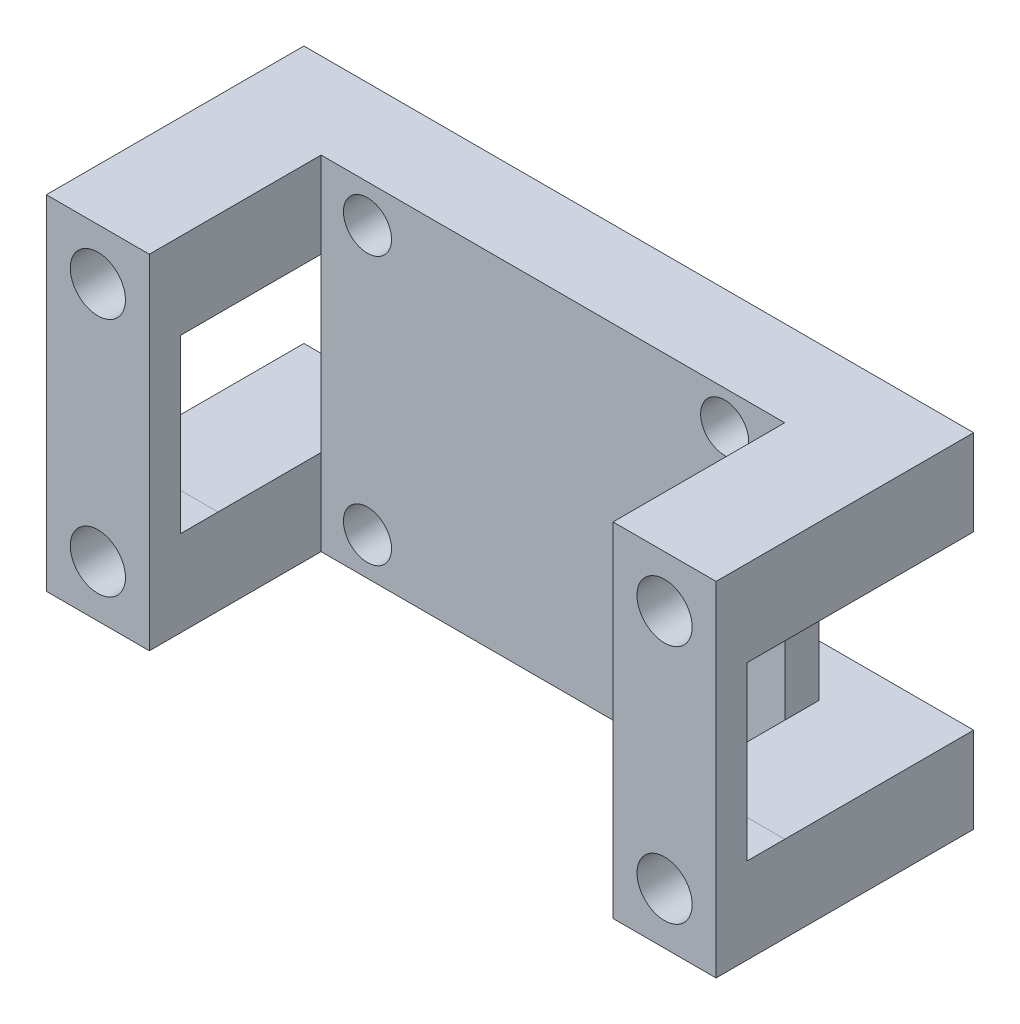
ISO-10303-21;
HEADER;
FILE_DESCRIPTION(('STEP AP214'),'2;1');
FILE_NAME('part.step','',(''),(''),'','','');
FILE_SCHEMA(('AUTOMOTIVE_DESIGN { 1 0 10303 214 1 1 1 1 }'));
ENDSEC;
DATA;
#1=APPLICATION_CONTEXT('core data for automotive mechanical design processes');
#2=APPLICATION_PROTOCOL_DEFINITION('international standard','automotive_design',2000,#1);
#3=PRODUCT_CONTEXT('',#1,'mechanical');
#4=PRODUCT('Part','Part','',(#3));
#5=PRODUCT_RELATED_PRODUCT_CATEGORY('part','',(#4));
#6=PRODUCT_DEFINITION_FORMATION('','',#4);
#7=PRODUCT_DEFINITION_CONTEXT('part definition',#1,'design');
#8=PRODUCT_DEFINITION('design','',#6,#7);
#9=PRODUCT_DEFINITION_SHAPE('','',#8);
#10=(LENGTH_UNIT() NAMED_UNIT(*) SI_UNIT(.MILLI.,.METRE.));
#11=(NAMED_UNIT(*) PLANE_ANGLE_UNIT() SI_UNIT($,.RADIAN.));
#12=(NAMED_UNIT(*) SI_UNIT($,.STERADIAN.) SOLID_ANGLE_UNIT());
#13=UNCERTAINTY_MEASURE_WITH_UNIT(LENGTH_MEASURE(1.E-05),#10,'distance_accuracy_value','');
#14=(GEOMETRIC_REPRESENTATION_CONTEXT(3) GLOBAL_UNCERTAINTY_ASSIGNED_CONTEXT((#13)) GLOBAL_UNIT_ASSIGNED_CONTEXT((#10,
#11,#12)) REPRESENTATION_CONTEXT('',''));
#15=CARTESIAN_POINT('',(0.,0.,0.));
#16=DIRECTION('',(0.,0.,1.));
#17=DIRECTION('',(1.,0.,0.));
#18=AXIS2_PLACEMENT_3D('',#15,#16,#17);
#19=CARTESIAN_POINT('',(0.,0.,2.54));
#20=DIRECTION('',(1.,0.,0.));
#21=DIRECTION('',(0.,0.,-1.));
#22=AXIS2_PLACEMENT_3D('',#19,#20,#21);
#23=PLANE('',#22);
#24=DIRECTION('',(0.,0.,-1.));
#25=VECTOR('',#24,1.);
#26=CARTESIAN_POINT('',(0.,6.35,15.24));
#27=LINE('',#26,#25);
#28=CARTESIAN_POINT('',(0.,6.35,2.54));
#29=VERTEX_POINT('',#28);
#30=CARTESIAN_POINT('',(0.,6.35,0.));
#31=VERTEX_POINT('',#30);
#32=EDGE_CURVE('E295',#29,#31,#27,.T.);
#33=ORIENTED_EDGE('',*,*,#32,.F.);
#34=DIRECTION('',(0.,-1.,0.));
#35=VECTOR('',#34,1.);
#36=CARTESIAN_POINT('',(0.,0.,2.54));
#37=LINE('',#36,#35);
#38=CARTESIAN_POINT('',(0.,19.05,2.54));
#39=VERTEX_POINT('',#38);
#40=EDGE_CURVE('E448',#39,#29,#37,.T.);
#41=ORIENTED_EDGE('',*,*,#40,.F.);
#42=DIRECTION('',(0.,0.,-1.));
#43=VECTOR('',#42,1.);
#44=CARTESIAN_POINT('',(0.,19.05,15.24));
#45=LINE('',#44,#43);
#46=CARTESIAN_POINT('',(0.,19.05,0.));
#47=VERTEX_POINT('',#46);
#48=EDGE_CURVE('E347',#39,#47,#45,.T.);
#49=ORIENTED_EDGE('',*,*,#48,.T.);
#50=DIRECTION('',(0.,-1.,0.));
#51=VECTOR('',#50,1.);
#52=CARTESIAN_POINT('',(0.,0.,0.));
#53=LINE('',#52,#51);
#54=EDGE_CURVE('E442',#47,#31,#53,.T.);
#55=ORIENTED_EDGE('',*,*,#54,.T.);
#56=EDGE_LOOP('',(#33,#41,#49,#55));
#57=FACE_BOUND('',#56,.T.);
#58=ADVANCED_FACE('F39',(#57),#23,.F.);
#59=CARTESIAN_POINT('',(34.29,0.,2.54));
#60=DIRECTION('',(-1.,0.,0.));
#61=DIRECTION('',(0.,0.,1.));
#62=AXIS2_PLACEMENT_3D('',#59,#60,#61);
#63=PLANE('',#62);
#64=DIRECTION('',(0.,0.,-1.));
#65=VECTOR('',#64,1.);
#66=CARTESIAN_POINT('',(34.29,6.34999999999999,15.24));
#67=LINE('',#66,#65);
#68=CARTESIAN_POINT('',(34.29,6.34999999999999,2.54));
#69=VERTEX_POINT('',#68);
#70=CARTESIAN_POINT('',(34.29,6.34999999999999,0.));
#71=VERTEX_POINT('',#70);
#72=EDGE_CURVE('E310',#69,#71,#67,.T.);
#73=ORIENTED_EDGE('',*,*,#72,.T.);
#74=DIRECTION('',(0.,1.,0.));
#75=VECTOR('',#74,1.);
#76=CARTESIAN_POINT('',(34.29,0.,0.));
#77=LINE('',#76,#75);
#78=CARTESIAN_POINT('',(34.29,19.05,0.));
#79=VERTEX_POINT('',#78);
#80=EDGE_CURVE('E463',#71,#79,#77,.T.);
#81=ORIENTED_EDGE('',*,*,#80,.T.);
#82=DIRECTION('',(0.,0.,-1.));
#83=VECTOR('',#82,1.);
#84=CARTESIAN_POINT('',(34.29,19.05,15.24));
#85=LINE('',#84,#83);
#86=CARTESIAN_POINT('',(34.29,19.05,2.54));
#87=VERTEX_POINT('',#86);
#88=EDGE_CURVE('E327',#87,#79,#85,.T.);
#89=ORIENTED_EDGE('',*,*,#88,.F.);
#90=DIRECTION('',(0.,1.,0.));
#91=VECTOR('',#90,1.);
#92=CARTESIAN_POINT('',(34.29,0.,2.54));
#93=LINE('',#92,#91);
#94=EDGE_CURVE('E452',#69,#87,#93,.T.);
#95=ORIENTED_EDGE('',*,*,#94,.F.);
#96=EDGE_LOOP('',(#73,#81,#89,#95));
#97=FACE_BOUND('',#96,.T.);
#98=ADVANCED_FACE('F555',(#97),#63,.F.);
#99=CARTESIAN_POINT('',(0.,0.,0.));
#100=DIRECTION('',(0.,0.,-1.));
#101=DIRECTION('',(-1.,0.,0.));
#102=AXIS2_PLACEMENT_3D('',#99,#100,#101);
#103=PLANE('',#102);
#104=ORIENTED_EDGE('',*,*,#80,.F.);
#105=DIRECTION('',(-1.,0.,0.));
#106=VECTOR('',#105,1.);
#107=CARTESIAN_POINT('',(0.,6.35,0.));
#108=LINE('',#107,#106);
#109=EDGE_CURVE('E47',#71,#31,#108,.T.);
#110=ORIENTED_EDGE('',*,*,#109,.T.);
#111=ORIENTED_EDGE('',*,*,#54,.F.);
#112=DIRECTION('',(-1.,0.,0.));
#113=VECTOR('',#112,1.);
#114=CARTESIAN_POINT('',(-7.62,19.05,0.));
#115=LINE('',#114,#113);
#116=EDGE_CURVE('E426',#79,#47,#115,.T.);
#117=ORIENTED_EDGE('',*,*,#116,.F.);
#118=EDGE_LOOP('',(#104,#110,#111,#117));
#119=FACE_BOUND('',#118,.T.);
#120=ADVANCED_FACE('F472',(#119),#103,.T.);
#121=CARTESIAN_POINT('',(0.,0.,2.54));
#122=DIRECTION('',(0.,1.,0.));
#123=DIRECTION('',(0.,0.,1.));
#124=AXIS2_PLACEMENT_3D('',#121,#122,#123);
#125=PLANE('',#124);
#126=DIRECTION('',(0.,0.,1.));
#127=VECTOR('',#126,1.);
#128=CARTESIAN_POINT('',(41.91,0.,-3.81));
#129=LINE('',#128,#127);
#130=CARTESIAN_POINT('',(41.91,0.,-3.81));
#131=VERTEX_POINT('',#130);
#132=CARTESIAN_POINT('',(41.91,0.,15.24));
#133=VERTEX_POINT('',#132);
#134=EDGE_CURVE('E402',#131,#133,#129,.T.);
#135=ORIENTED_EDGE('',*,*,#134,.T.);
#136=DIRECTION('',(1.,0.,0.));
#137=VECTOR('',#136,1.);
#138=CARTESIAN_POINT('',(41.91,0.,15.24));
#139=LINE('',#138,#137);
#140=CARTESIAN_POINT('',(34.29,0.,15.24));
#141=VERTEX_POINT('',#140);
#142=EDGE_CURVE('E303',#141,#133,#139,.T.);
#143=ORIENTED_EDGE('',*,*,#142,.F.);
#144=DIRECTION('',(0.,0.,-1.));
#145=VECTOR('',#144,1.);
#146=CARTESIAN_POINT('',(34.29,0.,15.24));
#147=LINE('',#146,#145);
#148=CARTESIAN_POINT('',(34.29,0.,2.54));
#149=VERTEX_POINT('',#148);
#150=EDGE_CURVE('E307',#141,#149,#147,.T.);
#151=ORIENTED_EDGE('',*,*,#150,.T.);
#152=DIRECTION('',(1.,0.,0.));
#153=VECTOR('',#152,1.);
#154=CARTESIAN_POINT('',(0.,0.,2.54));
#155=LINE('',#154,#153);
#156=CARTESIAN_POINT('',(0.,0.,2.54));
#157=VERTEX_POINT('',#156);
#158=EDGE_CURVE('E447',#157,#149,#155,.T.);
#159=ORIENTED_EDGE('',*,*,#158,.F.);
#160=DIRECTION('',(0.,0.,-1.));
#161=VECTOR('',#160,1.);
#162=CARTESIAN_POINT('',(0.,0.,15.24));
#163=LINE('',#162,#161);
#164=CARTESIAN_POINT('',(0.,0.,15.24));
#165=VERTEX_POINT('',#164);
#166=EDGE_CURVE('E292',#165,#157,#163,.T.);
#167=ORIENTED_EDGE('',*,*,#166,.F.);
#168=DIRECTION('',(1.,0.,0.));
#169=VECTOR('',#168,1.);
#170=CARTESIAN_POINT('',(0.,0.,15.24));
#171=LINE('',#170,#169);
#172=CARTESIAN_POINT('',(-7.62,0.,15.24));
#173=VERTEX_POINT('',#172);
#174=EDGE_CURVE('E288',#173,#165,#171,.T.);
#175=ORIENTED_EDGE('',*,*,#174,.F.);
#176=DIRECTION('',(0.,0.,1.));
#177=VECTOR('',#176,1.);
#178=CARTESIAN_POINT('',(-7.62,0.,-3.81));
#179=LINE('',#178,#177);
#180=CARTESIAN_POINT('',(-7.62,0.,-3.81));
#181=VERTEX_POINT('',#180);
#182=EDGE_CURVE('E399',#181,#173,#179,.T.);
#183=ORIENTED_EDGE('',*,*,#182,.F.);
#184=DIRECTION('',(-1.,0.,0.));
#185=VECTOR('',#184,1.);
#186=CARTESIAN_POINT('',(-7.62,0.,-3.81));
#187=LINE('',#186,#185);
#188=EDGE_CURVE('E396',#131,#181,#187,.T.);
#189=ORIENTED_EDGE('',*,*,#188,.F.);
#190=EDGE_LOOP('',(#135,#143,#151,#159,#167,#175,#183,#189));
#191=FACE_BOUND('',#190,.T.);
#192=ADVANCED_FACE('F515',(#191),#125,.F.);
#193=CARTESIAN_POINT('',(0.,25.4,2.54));
#194=DIRECTION('',(0.,-1.,0.));
#195=DIRECTION('',(0.,0.,-1.));
#196=AXIS2_PLACEMENT_3D('',#193,#194,#195);
#197=PLANE('',#196);
#198=DIRECTION('',(-1.,0.,0.));
#199=VECTOR('',#198,1.);
#200=CARTESIAN_POINT('',(0.,25.4,2.54));
#201=LINE('',#200,#199);
#202=CARTESIAN_POINT('',(34.29,25.4,2.54));
#203=VERTEX_POINT('',#202);
#204=CARTESIAN_POINT('',(0.,25.4,2.54));
#205=VERTEX_POINT('',#204);
#206=EDGE_CURVE('E430',#203,#205,#201,.T.);
#207=ORIENTED_EDGE('',*,*,#206,.F.);
#208=DIRECTION('',(0.,0.,-1.));
#209=VECTOR('',#208,1.);
#210=CARTESIAN_POINT('',(34.29,25.4,15.24));
#211=LINE('',#210,#209);
#212=CARTESIAN_POINT('',(34.29,25.4,15.24));
#213=VERTEX_POINT('',#212);
#214=EDGE_CURVE('E324',#213,#203,#211,.T.);
#215=ORIENTED_EDGE('',*,*,#214,.F.);
#216=DIRECTION('',(-1.,0.,0.));
#217=VECTOR('',#216,1.);
#218=CARTESIAN_POINT('',(34.29,25.4,15.24));
#219=LINE('',#218,#217);
#220=CARTESIAN_POINT('',(41.91,25.4,15.24));
#221=VERTEX_POINT('',#220);
#222=EDGE_CURVE('E321',#221,#213,#219,.T.);
#223=ORIENTED_EDGE('',*,*,#222,.F.);
#224=DIRECTION('',(0.,0.,1.));
#225=VECTOR('',#224,1.);
#226=CARTESIAN_POINT('',(41.91,25.4,-3.81));
#227=LINE('',#226,#225);
#228=CARTESIAN_POINT('',(41.91,25.4,-3.81));
#229=VERTEX_POINT('',#228);
#230=EDGE_CURVE('E436',#229,#221,#227,.T.);
#231=ORIENTED_EDGE('',*,*,#230,.F.);
#232=DIRECTION('',(1.,0.,0.));
#233=VECTOR('',#232,1.);
#234=CARTESIAN_POINT('',(-7.62,25.4,-3.81));
#235=LINE('',#234,#233);
#236=CARTESIAN_POINT('',(-7.62,25.4,-3.81));
#237=VERTEX_POINT('',#236);
#238=EDGE_CURVE('E416',#237,#229,#235,.T.);
#239=ORIENTED_EDGE('',*,*,#238,.F.);
#240=DIRECTION('',(0.,0.,1.));
#241=VECTOR('',#240,1.);
#242=CARTESIAN_POINT('',(-7.62,25.4,-3.81));
#243=LINE('',#242,#241);
#244=CARTESIAN_POINT('',(-7.62,25.4,15.24));
#245=VERTEX_POINT('',#244);
#246=EDGE_CURVE('E439',#237,#245,#243,.T.);
#247=ORIENTED_EDGE('',*,*,#246,.T.);
#248=DIRECTION('',(-1.,0.,0.));
#249=VECTOR('',#248,1.);
#250=CARTESIAN_POINT('',(0.,25.4,15.24));
#251=LINE('',#250,#249);
#252=CARTESIAN_POINT('',(0.,25.4,15.24));
#253=VERTEX_POINT('',#252);
#254=EDGE_CURVE('E339',#253,#245,#251,.T.);
#255=ORIENTED_EDGE('',*,*,#254,.F.);
#256=DIRECTION('',(0.,0.,-1.));
#257=VECTOR('',#256,1.);
#258=CARTESIAN_POINT('',(0.,25.4,15.24));
#259=LINE('',#258,#257);
#260=EDGE_CURVE('E351',#253,#205,#259,.T.);
#261=ORIENTED_EDGE('',*,*,#260,.T.);
#262=EDGE_LOOP('',(#207,#215,#223,#231,#239,#247,#255,#261));
#263=FACE_BOUND('',#262,.T.);
#264=ADVANCED_FACE('F525',(#263),#197,.F.);
#265=CARTESIAN_POINT('',(0.,0.,2.54));
#266=DIRECTION('',(0.,0.,-1.));
#267=DIRECTION('',(-1.,0.,0.));
#268=AXIS2_PLACEMENT_3D('',#265,#266,#267);
#269=PLANE('',#268);
#270=CARTESIAN_POINT('',(29.845,22.86,2.54));
#271=DIRECTION('',(0.,0.,-1.));
#272=DIRECTION('',(-1.,0.,0.));
#273=AXIS2_PLACEMENT_3D('',#270,#271,#272);
#274=CIRCLE('',#273,1.77799999999999);
#275=CARTESIAN_POINT('',(28.067,22.86,2.54));
#276=VERTEX_POINT('',#275);
#277=EDGE_CURVE('E382',#276,#276,#274,.T.);
#278=ORIENTED_EDGE('',*,*,#277,.T.);
#279=EDGE_LOOP('',(#278));
#280=FACE_BOUND('',#279,.T.);
#281=CARTESIAN_POINT('',(3.429,2.794,2.54));
#282=DIRECTION('',(0.,0.,-1.));
#283=DIRECTION('',(-1.,0.,0.));
#284=AXIS2_PLACEMENT_3D('',#281,#282,#283);
#285=CIRCLE('',#284,1.778);
#286=CARTESIAN_POINT('',(1.651,2.794,2.54));
#287=VERTEX_POINT('',#286);
#288=EDGE_CURVE('E374',#287,#287,#285,.T.);
#289=ORIENTED_EDGE('',*,*,#288,.T.);
#290=EDGE_LOOP('',(#289));
#291=FACE_BOUND('',#290,.T.);
#292=CARTESIAN_POINT('',(29.845,2.286,2.54));
#293=DIRECTION('',(0.,0.,-1.));
#294=DIRECTION('',(-1.,0.,0.));
#295=AXIS2_PLACEMENT_3D('',#292,#293,#294);
#296=CIRCLE('',#295,1.77799999999999);
#297=CARTESIAN_POINT('',(28.067,2.286,2.54));
#298=VERTEX_POINT('',#297);
#299=EDGE_CURVE('E370',#298,#298,#296,.T.);
#300=ORIENTED_EDGE('',*,*,#299,.T.);
#301=EDGE_LOOP('',(#300));
#302=FACE_BOUND('',#301,.T.);
#303=CARTESIAN_POINT('',(3.429,22.606,2.54));
#304=DIRECTION('',(0.,0.,-1.));
#305=DIRECTION('',(-1.,0.,0.));
#306=AXIS2_PLACEMENT_3D('',#303,#304,#305);
#307=CIRCLE('',#306,1.778);
#308=CARTESIAN_POINT('',(1.651,22.606,2.54));
#309=VERTEX_POINT('',#308);
#310=EDGE_CURVE('E378',#309,#309,#307,.T.);
#311=ORIENTED_EDGE('',*,*,#310,.T.);
#312=EDGE_LOOP('',(#311));
#313=FACE_BOUND('',#312,.T.);
#314=EDGE_CURVE('E443',#205,#39,#37,.T.);
#315=ORIENTED_EDGE('',*,*,#314,.T.);
#316=ORIENTED_EDGE('',*,*,#40,.T.);
#317=DIRECTION('',(0.,1.,0.));
#318=VECTOR('',#317,1.);
#319=CARTESIAN_POINT('',(0.,0.,2.54));
#320=LINE('',#319,#318);
#321=EDGE_CURVE('E299',#157,#29,#320,.T.);
#322=ORIENTED_EDGE('',*,*,#321,.F.);
#323=ORIENTED_EDGE('',*,*,#158,.T.);
#324=EDGE_CURVE('E453',#149,#69,#93,.T.);
#325=ORIENTED_EDGE('',*,*,#324,.T.);
#326=ORIENTED_EDGE('',*,*,#94,.T.);
#327=DIRECTION('',(0.,-1.,0.));
#328=VECTOR('',#327,1.);
#329=CARTESIAN_POINT('',(34.29,0.,2.54));
#330=LINE('',#329,#328);
#331=EDGE_CURVE('E331',#203,#87,#330,.T.);
#332=ORIENTED_EDGE('',*,*,#331,.F.);
#333=ORIENTED_EDGE('',*,*,#206,.T.);
#334=EDGE_LOOP('',(#315,#316,#322,#323,#325,#326,#332,#333));
#335=FACE_BOUND('',#334,.T.);
#336=ADVANCED_FACE('F541',(#280,#291,#302,#313,#335),#269,.F.);
#337=CARTESIAN_POINT('',(-7.62,25.4,-3.81));
#338=DIRECTION('',(1.,0.,0.));
#339=DIRECTION('',(0.,1.,0.));
#340=AXIS2_PLACEMENT_3D('',#337,#338,#339);
#341=PLANE('',#340);
#342=DIRECTION('',(0.,0.,1.));
#343=VECTOR('',#342,1.);
#344=CARTESIAN_POINT('',(-7.62,19.05,-3.81));
#345=LINE('',#344,#343);
#346=CARTESIAN_POINT('',(-7.62,19.05,-3.81));
#347=VERTEX_POINT('',#346);
#348=CARTESIAN_POINT('',(-7.62,19.05,12.954));
#349=VERTEX_POINT('',#348);
#350=EDGE_CURVE('E425',#347,#349,#345,.T.);
#351=ORIENTED_EDGE('',*,*,#350,.T.);
#352=DIRECTION('',(0.,1.,0.));
#353=VECTOR('',#352,1.);
#354=CARTESIAN_POINT('',(-7.62,19.05,12.954));
#355=LINE('',#354,#353);
#356=CARTESIAN_POINT('',(-7.62,6.35030873739666,12.954));
#357=VERTEX_POINT('',#356);
#358=EDGE_CURVE('E214',#357,#349,#355,.T.);
#359=ORIENTED_EDGE('',*,*,#358,.F.);
#360=DIRECTION('',(0.,0.,1.));
#361=VECTOR('',#360,1.);
#362=CARTESIAN_POINT('',(-7.62,6.35030873739666,10.16));
#363=LINE('',#362,#361);
#364=CARTESIAN_POINT('',(-7.62,6.35030873739666,10.16));
#365=VERTEX_POINT('',#364);
#366=EDGE_CURVE('E218',#365,#357,#363,.T.);
#367=ORIENTED_EDGE('',*,*,#366,.F.);
#368=DIRECTION('',(0.,-1.,0.));
#369=VECTOR('',#368,1.);
#370=CARTESIAN_POINT('',(-7.62,25.4,10.16));
#371=LINE('',#370,#369);
#372=CARTESIAN_POINT('',(-7.62,6.35,10.16));
#373=VERTEX_POINT('',#372);
#374=EDGE_CURVE('E278',#365,#373,#371,.T.);
#375=ORIENTED_EDGE('',*,*,#374,.T.);
#376=DIRECTION('',(0.,0.,1.));
#377=VECTOR('',#376,1.);
#378=CARTESIAN_POINT('',(-7.62,6.35,-3.81));
#379=LINE('',#378,#377);
#380=CARTESIAN_POINT('',(-7.62,6.35,-3.81));
#381=VERTEX_POINT('',#380);
#382=EDGE_CURVE('E408',#381,#373,#379,.T.);
#383=ORIENTED_EDGE('',*,*,#382,.F.);
#384=DIRECTION('',(0.,1.,0.));
#385=VECTOR('',#384,1.);
#386=CARTESIAN_POINT('',(-7.62,0.,-3.81));
#387=LINE('',#386,#385);
#388=EDGE_CURVE('E386',#181,#381,#387,.T.);
#389=ORIENTED_EDGE('',*,*,#388,.F.);
#390=ORIENTED_EDGE('',*,*,#182,.T.);
#391=DIRECTION('',(0.,-1.,0.));
#392=VECTOR('',#391,1.);
#393=CARTESIAN_POINT('',(-7.62,25.4,15.24));
#394=LINE('',#393,#392);
#395=EDGE_CURVE('E343',#245,#173,#394,.T.);
#396=ORIENTED_EDGE('',*,*,#395,.F.);
#397=ORIENTED_EDGE('',*,*,#246,.F.);
#398=DIRECTION('',(0.,1.,0.));
#399=VECTOR('',#398,1.);
#400=CARTESIAN_POINT('',(-7.62,25.4,-3.81));
#401=LINE('',#400,#399);
#402=EDGE_CURVE('E412',#347,#237,#401,.T.);
#403=ORIENTED_EDGE('',*,*,#402,.F.);
#404=EDGE_LOOP('',(#351,#359,#367,#375,#383,#389,#390,#396,#397,#403));
#405=FACE_BOUND('',#404,.T.);
#406=ADVANCED_FACE('F497',(#405),#341,.F.);
#407=CARTESIAN_POINT('',(41.91,25.4,-3.81));
#408=DIRECTION('',(-1.,0.,0.));
#409=DIRECTION('',(0.,0.,1.));
#410=AXIS2_PLACEMENT_3D('',#407,#408,#409);
#411=PLANE('',#410);
#412=DIRECTION('',(0.,1.,0.));
#413=VECTOR('',#412,1.);
#414=CARTESIAN_POINT('',(41.91,19.05,12.954));
#415=LINE('',#414,#413);
#416=CARTESIAN_POINT('',(41.91,6.35030873739665,12.954));
#417=VERTEX_POINT('',#416);
#418=CARTESIAN_POINT('',(41.91,19.05,12.954));
#419=VERTEX_POINT('',#418);
#420=EDGE_CURVE('E200',#417,#419,#415,.T.);
#421=ORIENTED_EDGE('',*,*,#420,.T.);
#422=DIRECTION('',(0.,0.,1.));
#423=VECTOR('',#422,1.);
#424=CARTESIAN_POINT('',(41.91,19.05,-3.81));
#425=LINE('',#424,#423);
#426=CARTESIAN_POINT('',(41.91,19.05,-3.81));
#427=VERTEX_POINT('',#426);
#428=EDGE_CURVE('E433',#427,#419,#425,.T.);
#429=ORIENTED_EDGE('',*,*,#428,.F.);
#430=DIRECTION('',(0.,-1.,0.));
#431=VECTOR('',#430,1.);
#432=CARTESIAN_POINT('',(41.91,25.4,-3.81));
#433=LINE('',#432,#431);
#434=EDGE_CURVE('E419',#229,#427,#433,.T.);
#435=ORIENTED_EDGE('',*,*,#434,.F.);
#436=ORIENTED_EDGE('',*,*,#230,.T.);
#437=DIRECTION('',(0.,1.,0.));
#438=VECTOR('',#437,1.);
#439=CARTESIAN_POINT('',(41.91,25.4,15.24));
#440=LINE('',#439,#438);
#441=EDGE_CURVE('E317',#133,#221,#440,.T.);
#442=ORIENTED_EDGE('',*,*,#441,.F.);
#443=ORIENTED_EDGE('',*,*,#134,.F.);
#444=DIRECTION('',(0.,-1.,0.));
#445=VECTOR('',#444,1.);
#446=CARTESIAN_POINT('',(41.91,0.,-3.81));
#447=LINE('',#446,#445);
#448=CARTESIAN_POINT('',(41.91,6.34999999999999,-3.81));
#449=VERTEX_POINT('',#448);
#450=EDGE_CURVE('E393',#449,#131,#447,.T.);
#451=ORIENTED_EDGE('',*,*,#450,.F.);
#452=DIRECTION('',(0.,0.,1.));
#453=VECTOR('',#452,1.);
#454=CARTESIAN_POINT('',(41.91,6.34999999999999,-3.81));
#455=LINE('',#454,#453);
#456=CARTESIAN_POINT('',(41.91,6.34999999999999,10.16));
#457=VERTEX_POINT('',#456);
#458=EDGE_CURVE('E405',#449,#457,#455,.T.);
#459=ORIENTED_EDGE('',*,*,#458,.T.);
#460=DIRECTION('',(0.,-1.,0.));
#461=VECTOR('',#460,1.);
#462=CARTESIAN_POINT('',(41.91,25.4,10.16));
#463=LINE('',#462,#461);
#464=CARTESIAN_POINT('',(41.91,6.35030873739665,10.16));
#465=VERTEX_POINT('',#464);
#466=EDGE_CURVE('E212',#465,#457,#463,.T.);
#467=ORIENTED_EDGE('',*,*,#466,.F.);
#468=DIRECTION('',(0.,0.,1.));
#469=VECTOR('',#468,1.);
#470=CARTESIAN_POINT('',(41.91,6.35030873739665,10.16));
#471=LINE('',#470,#469);
#472=EDGE_CURVE('E62',#465,#417,#471,.T.);
#473=ORIENTED_EDGE('',*,*,#472,.T.);
#474=EDGE_LOOP('',(#421,#429,#435,#436,#442,#443,#451,#459,#467,#473));
#475=FACE_BOUND('',#474,.T.);
#476=ADVANCED_FACE('F210',(#475),#411,.F.);
#477=CARTESIAN_POINT('',(-7.62,19.05,-3.81));
#478=DIRECTION('',(0.,1.,0.));
#479=DIRECTION('',(-1.,0.,0.));
#480=AXIS2_PLACEMENT_3D('',#477,#478,#479);
#481=PLANE('',#480);
#482=ORIENTED_EDGE('',*,*,#428,.T.);
#483=DIRECTION('',(-1.,0.,0.));
#484=VECTOR('',#483,1.);
#485=CARTESIAN_POINT('',(41.91,19.05,12.954));
#486=LINE('',#485,#484);
#487=CARTESIAN_POINT('',(34.29,19.05,12.954));
#488=VERTEX_POINT('',#487);
#489=EDGE_CURVE('E203',#419,#488,#486,.T.);
#490=ORIENTED_EDGE('',*,*,#489,.T.);
#491=EDGE_CURVE('E328',#488,#87,#85,.T.);
#492=ORIENTED_EDGE('',*,*,#491,.T.);
#493=ORIENTED_EDGE('',*,*,#88,.T.);
#494=ORIENTED_EDGE('',*,*,#116,.T.);
#495=ORIENTED_EDGE('',*,*,#48,.F.);
#496=CARTESIAN_POINT('',(0.,19.05,12.954));
#497=VERTEX_POINT('',#496);
#498=EDGE_CURVE('E348',#497,#39,#45,.T.);
#499=ORIENTED_EDGE('',*,*,#498,.F.);
#500=EDGE_CURVE('E195',#497,#349,#486,.T.);
#501=ORIENTED_EDGE('',*,*,#500,.T.);
#502=ORIENTED_EDGE('',*,*,#350,.F.);
#503=DIRECTION('',(-1.,0.,0.));
#504=VECTOR('',#503,1.);
#505=CARTESIAN_POINT('',(-7.62,19.05,-3.81));
#506=LINE('',#505,#504);
#507=EDGE_CURVE('E422',#427,#347,#506,.T.);
#508=ORIENTED_EDGE('',*,*,#507,.F.);
#509=EDGE_LOOP('',(#482,#490,#492,#493,#494,#495,#499,#501,#502,#508));
#510=FACE_BOUND('',#509,.T.);
#511=ADVANCED_FACE('F533',(#510),#481,.F.);
#512=CARTESIAN_POINT('',(0.,0.,-3.81));
#513=DIRECTION('',(0.,0.,1.));
#514=DIRECTION('',(1.,0.,0.));
#515=AXIS2_PLACEMENT_3D('',#512,#513,#514);
#516=PLANE('',#515);
#517=CARTESIAN_POINT('',(38.1,21.59,-3.81));
#518=DIRECTION('',(0.,0.,1.));
#519=DIRECTION('',(1.,0.,0.));
#520=AXIS2_PLACEMENT_3D('',#517,#518,#519);
#521=CIRCLE('',#520,2.039999984);
#522=CARTESIAN_POINT('',(40.139999984,21.59,-3.81));
#523=VERTEX_POINT('',#522);
#524=EDGE_CURVE('E246',#523,#523,#521,.T.);
#525=ORIENTED_EDGE('',*,*,#524,.T.);
#526=EDGE_LOOP('',(#525));
#527=FACE_BOUND('',#526,.T.);
#528=CARTESIAN_POINT('',(-3.81,21.59,-3.81));
#529=DIRECTION('',(0.,0.,1.));
#530=DIRECTION('',(1.,0.,0.));
#531=AXIS2_PLACEMENT_3D('',#528,#529,#530);
#532=CIRCLE('',#531,2.039999984);
#533=CARTESIAN_POINT('',(-1.770000016,21.59,-3.81));
#534=VERTEX_POINT('',#533);
#535=EDGE_CURVE('E238',#534,#534,#532,.T.);
#536=ORIENTED_EDGE('',*,*,#535,.T.);
#537=EDGE_LOOP('',(#536));
#538=FACE_BOUND('',#537,.T.);
#539=CARTESIAN_POINT('',(29.845,22.86,-3.81));
#540=DIRECTION('',(0.,0.,1.));
#541=DIRECTION('',(1.,0.,0.));
#542=AXIS2_PLACEMENT_3D('',#539,#540,#541);
#543=CIRCLE('',#542,1.77799999999999);
#544=CARTESIAN_POINT('',(31.623,22.86,-3.81));
#545=VERTEX_POINT('',#544);
#546=EDGE_CURVE('E359',#545,#545,#543,.T.);
#547=ORIENTED_EDGE('',*,*,#546,.T.);
#548=EDGE_LOOP('',(#547));
#549=FACE_BOUND('',#548,.T.);
#550=CARTESIAN_POINT('',(3.429,22.606,-3.81));
#551=DIRECTION('',(0.,0.,1.));
#552=DIRECTION('',(1.,0.,0.));
#553=AXIS2_PLACEMENT_3D('',#550,#551,#552);
#554=CIRCLE('',#553,1.778);
#555=CARTESIAN_POINT('',(5.207,22.606,-3.81));
#556=VERTEX_POINT('',#555);
#557=EDGE_CURVE('E363',#556,#556,#554,.T.);
#558=ORIENTED_EDGE('',*,*,#557,.T.);
#559=EDGE_LOOP('',(#558));
#560=FACE_BOUND('',#559,.T.);
#561=ORIENTED_EDGE('',*,*,#402,.T.);
#562=ORIENTED_EDGE('',*,*,#238,.T.);
#563=ORIENTED_EDGE('',*,*,#434,.T.);
#564=ORIENTED_EDGE('',*,*,#507,.T.);
#565=EDGE_LOOP('',(#561,#562,#563,#564));
#566=FACE_BOUND('',#565,.T.);
#567=ADVANCED_FACE('F530',(#527,#538,#549,#560,#566),#516,.F.);
#568=CARTESIAN_POINT('',(-7.62,6.35,-3.81));
#569=DIRECTION('',(0.,-1.,0.));
#570=DIRECTION('',(1.,0.,0.));
#571=AXIS2_PLACEMENT_3D('',#568,#569,#570);
#572=PLANE('',#571);
#573=CARTESIAN_POINT('',(34.29,6.34999999999999,10.16));
#574=VERTEX_POINT('',#573);
#575=EDGE_CURVE('E311',#574,#69,#67,.T.);
#576=ORIENTED_EDGE('',*,*,#575,.F.);
#577=DIRECTION('',(1.,0.,0.));
#578=VECTOR('',#577,1.);
#579=CARTESIAN_POINT('',(-7.62,6.35,10.16));
#580=LINE('',#579,#578);
#581=EDGE_CURVE('E272',#574,#457,#580,.T.);
#582=ORIENTED_EDGE('',*,*,#581,.T.);
#583=ORIENTED_EDGE('',*,*,#458,.F.);
#584=DIRECTION('',(1.,0.,0.));
#585=VECTOR('',#584,1.);
#586=CARTESIAN_POINT('',(-7.62,6.35,-3.81));
#587=LINE('',#586,#585);
#588=EDGE_CURVE('E390',#381,#449,#587,.T.);
#589=ORIENTED_EDGE('',*,*,#588,.F.);
#590=ORIENTED_EDGE('',*,*,#382,.T.);
#591=DIRECTION('',(1.,0.,0.));
#592=VECTOR('',#591,1.);
#593=CARTESIAN_POINT('',(-7.62,6.35,10.16));
#594=LINE('',#593,#592);
#595=CARTESIAN_POINT('',(0.,6.35,10.16));
#596=VERTEX_POINT('',#595);
#597=EDGE_CURVE('E282',#373,#596,#594,.T.);
#598=ORIENTED_EDGE('',*,*,#597,.T.);
#599=EDGE_CURVE('E296',#596,#29,#27,.T.);
#600=ORIENTED_EDGE('',*,*,#599,.T.);
#601=ORIENTED_EDGE('',*,*,#32,.T.);
#602=ORIENTED_EDGE('',*,*,#109,.F.);
#603=ORIENTED_EDGE('',*,*,#72,.F.);
#604=EDGE_LOOP('',(#576,#582,#583,#589,#590,#598,#600,#601,#602,#603));
#605=FACE_BOUND('',#604,.T.);
#606=ADVANCED_FACE('F503',(#605),#572,.F.);
#607=CARTESIAN_POINT('',(0.,0.,-3.81));
#608=DIRECTION('',(0.,0.,-1.));
#609=DIRECTION('',(-1.,0.,0.));
#610=AXIS2_PLACEMENT_3D('',#607,#608,#609);
#611=PLANE('',#610);
#612=CARTESIAN_POINT('',(-3.81,3.81,-3.81));
#613=DIRECTION('',(0.,0.,1.));
#614=DIRECTION('',(1.,0.,0.));
#615=AXIS2_PLACEMENT_3D('',#612,#613,#614);
#616=CIRCLE('',#615,2.039999984);
#617=CARTESIAN_POINT('',(-1.770000016,3.81,-3.81));
#618=VERTEX_POINT('',#617);
#619=EDGE_CURVE('E255',#618,#618,#616,.T.);
#620=ORIENTED_EDGE('',*,*,#619,.T.);
#621=EDGE_LOOP('',(#620));
#622=FACE_BOUND('',#621,.T.);
#623=CARTESIAN_POINT('',(38.1,3.81,-3.81));
#624=DIRECTION('',(0.,0.,1.));
#625=DIRECTION('',(1.,0.,0.));
#626=AXIS2_PLACEMENT_3D('',#623,#624,#625);
#627=CIRCLE('',#626,2.04);
#628=CARTESIAN_POINT('',(40.14,3.81,-3.81));
#629=VERTEX_POINT('',#628);
#630=EDGE_CURVE('E262',#629,#629,#627,.T.);
#631=ORIENTED_EDGE('',*,*,#630,.T.);
#632=EDGE_LOOP('',(#631));
#633=FACE_BOUND('',#632,.T.);
#634=CARTESIAN_POINT('',(3.429,2.794,-3.81));
#635=DIRECTION('',(0.,0.,1.));
#636=DIRECTION('',(1.,0.,0.));
#637=AXIS2_PLACEMENT_3D('',#634,#635,#636);
#638=CIRCLE('',#637,1.778);
#639=CARTESIAN_POINT('',(5.207,2.794,-3.81));
#640=VERTEX_POINT('',#639);
#641=EDGE_CURVE('E358',#640,#640,#638,.T.);
#642=ORIENTED_EDGE('',*,*,#641,.T.);
#643=EDGE_LOOP('',(#642));
#644=FACE_BOUND('',#643,.T.);
#645=CARTESIAN_POINT('',(29.845,2.286,-3.81));
#646=DIRECTION('',(0.,0.,1.));
#647=DIRECTION('',(1.,0.,0.));
#648=AXIS2_PLACEMENT_3D('',#645,#646,#647);
#649=CIRCLE('',#648,1.77799999999999);
#650=CARTESIAN_POINT('',(31.623,2.286,-3.81));
#651=VERTEX_POINT('',#650);
#652=EDGE_CURVE('E354',#651,#651,#649,.T.);
#653=ORIENTED_EDGE('',*,*,#652,.T.);
#654=EDGE_LOOP('',(#653));
#655=FACE_BOUND('',#654,.T.);
#656=ORIENTED_EDGE('',*,*,#388,.T.);
#657=ORIENTED_EDGE('',*,*,#588,.T.);
#658=ORIENTED_EDGE('',*,*,#450,.T.);
#659=ORIENTED_EDGE('',*,*,#188,.T.);
#660=EDGE_LOOP('',(#656,#657,#658,#659));
#661=FACE_BOUND('',#660,.T.);
#662=ADVANCED_FACE('F509',(#622,#633,#644,#655,#661),#611,.T.);
#663=CARTESIAN_POINT('',(29.845,2.286,-3.81));
#664=DIRECTION('',(0.,0.,1.));
#665=DIRECTION('',(1.,0.,0.));
#666=AXIS2_PLACEMENT_3D('',#663,#664,#665);
#667=CYLINDRICAL_SURFACE('',#666,1.77799999999999);
#668=ORIENTED_EDGE('',*,*,#652,.F.);
#669=EDGE_LOOP('',(#668));
#670=FACE_BOUND('',#669,.T.);
#671=ORIENTED_EDGE('',*,*,#299,.F.);
#672=EDGE_LOOP('',(#671));
#673=FACE_BOUND('',#672,.T.);
#674=ADVANCED_FACE('F608',(#670,#673),#667,.F.);
#675=CARTESIAN_POINT('',(3.429,2.794,-3.81));
#676=DIRECTION('',(0.,0.,1.));
#677=DIRECTION('',(1.,0.,0.));
#678=AXIS2_PLACEMENT_3D('',#675,#676,#677);
#679=CYLINDRICAL_SURFACE('',#678,1.778);
#680=ORIENTED_EDGE('',*,*,#641,.F.);
#681=EDGE_LOOP('',(#680));
#682=FACE_BOUND('',#681,.T.);
#683=ORIENTED_EDGE('',*,*,#288,.F.);
#684=EDGE_LOOP('',(#683));
#685=FACE_BOUND('',#684,.T.);
#686=ADVANCED_FACE('F614',(#682,#685),#679,.F.);
#687=CARTESIAN_POINT('',(3.429,22.606,-3.81));
#688=DIRECTION('',(0.,0.,1.));
#689=DIRECTION('',(1.,0.,0.));
#690=AXIS2_PLACEMENT_3D('',#687,#688,#689);
#691=CYLINDRICAL_SURFACE('',#690,1.778);
#692=ORIENTED_EDGE('',*,*,#557,.F.);
#693=EDGE_LOOP('',(#692));
#694=FACE_BOUND('',#693,.T.);
#695=ORIENTED_EDGE('',*,*,#310,.F.);
#696=EDGE_LOOP('',(#695));
#697=FACE_BOUND('',#696,.T.);
#698=ADVANCED_FACE('F610',(#694,#697),#691,.F.);
#699=CARTESIAN_POINT('',(29.845,22.86,-3.81));
#700=DIRECTION('',(0.,0.,1.));
#701=DIRECTION('',(1.,0.,0.));
#702=AXIS2_PLACEMENT_3D('',#699,#700,#701);
#703=CYLINDRICAL_SURFACE('',#702,1.77799999999999);
#704=ORIENTED_EDGE('',*,*,#546,.F.);
#705=EDGE_LOOP('',(#704));
#706=FACE_BOUND('',#705,.T.);
#707=ORIENTED_EDGE('',*,*,#277,.F.);
#708=EDGE_LOOP('',(#707));
#709=FACE_BOUND('',#708,.T.);
#710=ADVANCED_FACE('F613',(#706,#709),#703,.F.);
#711=CARTESIAN_POINT('',(0.,25.4,15.24));
#712=DIRECTION('',(-1.,0.,0.));
#713=DIRECTION('',(0.,0.,1.));
#714=AXIS2_PLACEMENT_3D('',#711,#712,#713);
#715=PLANE('',#714);
#716=DIRECTION('',(0.,1.,0.));
#717=VECTOR('',#716,1.);
#718=CARTESIAN_POINT('',(0.,25.4,12.954));
#719=LINE('',#718,#717);
#720=CARTESIAN_POINT('',(0.,6.35030873739666,12.954));
#721=VERTEX_POINT('',#720);
#722=EDGE_CURVE('E233',#721,#497,#719,.T.);
#723=ORIENTED_EDGE('',*,*,#722,.T.);
#724=ORIENTED_EDGE('',*,*,#498,.T.);
#725=ORIENTED_EDGE('',*,*,#314,.F.);
#726=ORIENTED_EDGE('',*,*,#260,.F.);
#727=DIRECTION('',(0.,1.,0.));
#728=VECTOR('',#727,1.);
#729=CARTESIAN_POINT('',(0.,25.4,15.24));
#730=LINE('',#729,#728);
#731=EDGE_CURVE('E335',#165,#253,#730,.T.);
#732=ORIENTED_EDGE('',*,*,#731,.F.);
#733=ORIENTED_EDGE('',*,*,#166,.T.);
#734=ORIENTED_EDGE('',*,*,#321,.T.);
#735=ORIENTED_EDGE('',*,*,#599,.F.);
#736=DIRECTION('',(0.,-1.,0.));
#737=VECTOR('',#736,1.);
#738=CARTESIAN_POINT('',(0.,25.4,10.16));
#739=LINE('',#738,#737);
#740=CARTESIAN_POINT('',(0.,6.35030873739666,10.16));
#741=VERTEX_POINT('',#740);
#742=EDGE_CURVE('E279',#741,#596,#739,.T.);
#743=ORIENTED_EDGE('',*,*,#742,.F.);
#744=DIRECTION('',(0.,0.,1.));
#745=VECTOR('',#744,1.);
#746=CARTESIAN_POINT('',(0.,6.35030873739666,15.24));
#747=LINE('',#746,#745);
#748=EDGE_CURVE('E54',#741,#721,#747,.T.);
#749=ORIENTED_EDGE('',*,*,#748,.T.);
#750=EDGE_LOOP('',(#723,#724,#725,#726,#732,#733,#734,#735,#743,#749));
#751=FACE_BOUND('',#750,.T.);
#752=ADVANCED_FACE('F538',(#751),#715,.F.);
#753=CARTESIAN_POINT('',(0.,0.,15.24));
#754=DIRECTION('',(0.,0.,-1.));
#755=DIRECTION('',(-1.,0.,0.));
#756=AXIS2_PLACEMENT_3D('',#753,#754,#755);
#757=PLANE('',#756);
#758=CARTESIAN_POINT('',(-3.81,3.81,15.24));
#759=DIRECTION('',(0.,0.,1.));
#760=DIRECTION('',(1.,0.,0.));
#761=AXIS2_PLACEMENT_3D('',#758,#759,#760);
#762=CIRCLE('',#761,2.039999984);
#763=CARTESIAN_POINT('',(-1.770000016,3.81,15.24));
#764=VERTEX_POINT('',#763);
#765=EDGE_CURVE('E242',#764,#764,#762,.T.);
#766=ORIENTED_EDGE('',*,*,#765,.F.);
#767=EDGE_LOOP('',(#766));
#768=FACE_BOUND('',#767,.T.);
#769=CARTESIAN_POINT('',(-3.81,21.59,15.24));
#770=DIRECTION('',(0.,0.,1.));
#771=DIRECTION('',(1.,0.,0.));
#772=AXIS2_PLACEMENT_3D('',#769,#770,#771);
#773=CIRCLE('',#772,2.039999984);
#774=CARTESIAN_POINT('',(-1.770000016,21.59,15.24));
#775=VERTEX_POINT('',#774);
#776=EDGE_CURVE('E237',#775,#775,#773,.T.);
#777=ORIENTED_EDGE('',*,*,#776,.F.);
#778=EDGE_LOOP('',(#777));
#779=FACE_BOUND('',#778,.T.);
#780=ORIENTED_EDGE('',*,*,#731,.T.);
#781=ORIENTED_EDGE('',*,*,#254,.T.);
#782=ORIENTED_EDGE('',*,*,#395,.T.);
#783=ORIENTED_EDGE('',*,*,#174,.T.);
#784=EDGE_LOOP('',(#780,#781,#782,#783));
#785=FACE_BOUND('',#784,.T.);
#786=ADVANCED_FACE('F519',(#768,#779,#785),#757,.F.);
#787=CARTESIAN_POINT('',(34.29,25.4,15.24));
#788=DIRECTION('',(1.,0.,0.));
#789=DIRECTION('',(0.,0.,-1.));
#790=AXIS2_PLACEMENT_3D('',#787,#788,#789);
#791=PLANE('',#790);
#792=ORIENTED_EDGE('',*,*,#491,.F.);
#793=DIRECTION('',(0.,-1.,0.));
#794=VECTOR('',#793,1.);
#795=CARTESIAN_POINT('',(34.29,25.4,12.954));
#796=LINE('',#795,#794);
#797=CARTESIAN_POINT('',(34.29,6.35030873739665,12.954));
#798=VERTEX_POINT('',#797);
#799=EDGE_CURVE('E11',#488,#798,#796,.T.);
#800=ORIENTED_EDGE('',*,*,#799,.T.);
#801=DIRECTION('',(0.,0.,-1.));
#802=VECTOR('',#801,1.);
#803=CARTESIAN_POINT('',(34.29,6.35030873739665,15.24));
#804=LINE('',#803,#802);
#805=CARTESIAN_POINT('',(34.29,6.35030873739665,10.16));
#806=VERTEX_POINT('',#805);
#807=EDGE_CURVE('E191',#798,#806,#804,.T.);
#808=ORIENTED_EDGE('',*,*,#807,.T.);
#809=DIRECTION('',(0.,-1.,0.));
#810=VECTOR('',#809,1.);
#811=CARTESIAN_POINT('',(34.29,25.4,10.16));
#812=LINE('',#811,#810);
#813=EDGE_CURVE('E266',#806,#574,#812,.T.);
#814=ORIENTED_EDGE('',*,*,#813,.T.);
#815=ORIENTED_EDGE('',*,*,#575,.T.);
#816=ORIENTED_EDGE('',*,*,#324,.F.);
#817=ORIENTED_EDGE('',*,*,#150,.F.);
#818=DIRECTION('',(0.,-1.,0.));
#819=VECTOR('',#818,1.);
#820=CARTESIAN_POINT('',(34.29,25.4,15.24));
#821=LINE('',#820,#819);
#822=EDGE_CURVE('E314',#213,#141,#821,.T.);
#823=ORIENTED_EDGE('',*,*,#822,.F.);
#824=ORIENTED_EDGE('',*,*,#214,.T.);
#825=ORIENTED_EDGE('',*,*,#331,.T.);
#826=EDGE_LOOP('',(#792,#800,#808,#814,#815,#816,#817,#823,#824,#825));
#827=FACE_BOUND('',#826,.T.);
#828=ADVANCED_FACE('F547',(#827),#791,.F.);
#829=CARTESIAN_POINT('',(0.,0.,15.24));
#830=DIRECTION('',(0.,0.,1.));
#831=DIRECTION('',(1.,0.,0.));
#832=AXIS2_PLACEMENT_3D('',#829,#830,#831);
#833=PLANE('',#832);
#834=CARTESIAN_POINT('',(38.1,21.59,15.24));
#835=DIRECTION('',(0.,0.,1.));
#836=DIRECTION('',(1.,0.,0.));
#837=AXIS2_PLACEMENT_3D('',#834,#835,#836);
#838=CIRCLE('',#837,2.039999984);
#839=CARTESIAN_POINT('',(40.139999984,21.59,15.24));
#840=VERTEX_POINT('',#839);
#841=EDGE_CURVE('E251',#840,#840,#838,.T.);
#842=ORIENTED_EDGE('',*,*,#841,.F.);
#843=EDGE_LOOP('',(#842));
#844=FACE_BOUND('',#843,.T.);
#845=CARTESIAN_POINT('',(38.1,3.81,15.24));
#846=DIRECTION('',(0.,0.,1.));
#847=DIRECTION('',(1.,0.,0.));
#848=AXIS2_PLACEMENT_3D('',#845,#846,#847);
#849=CIRCLE('',#848,2.04);
#850=CARTESIAN_POINT('',(40.14,3.81,15.24));
#851=VERTEX_POINT('',#850);
#852=EDGE_CURVE('E250',#851,#851,#849,.T.);
#853=ORIENTED_EDGE('',*,*,#852,.F.);
#854=EDGE_LOOP('',(#853));
#855=FACE_BOUND('',#854,.T.);
#856=ORIENTED_EDGE('',*,*,#822,.T.);
#857=ORIENTED_EDGE('',*,*,#142,.T.);
#858=ORIENTED_EDGE('',*,*,#441,.T.);
#859=ORIENTED_EDGE('',*,*,#222,.T.);
#860=EDGE_LOOP('',(#856,#857,#858,#859));
#861=FACE_BOUND('',#860,.T.);
#862=ADVANCED_FACE('F558',(#844,#855,#861),#833,.T.);
#863=CARTESIAN_POINT('',(-7.62,25.4,10.16));
#864=DIRECTION('',(0.,0.,-1.));
#865=DIRECTION('',(-1.,0.,0.));
#866=AXIS2_PLACEMENT_3D('',#863,#864,#865);
#867=PLANE('',#866);
#868=DIRECTION('',(-1.,0.,0.));
#869=VECTOR('',#868,1.);
#870=CARTESIAN_POINT('',(41.91,6.35030873739665,10.16));
#871=LINE('',#870,#869);
#872=EDGE_CURVE('E207',#741,#365,#871,.T.);
#873=ORIENTED_EDGE('',*,*,#872,.F.);
#874=ORIENTED_EDGE('',*,*,#742,.T.);
#875=ORIENTED_EDGE('',*,*,#597,.F.);
#876=ORIENTED_EDGE('',*,*,#374,.F.);
#877=EDGE_LOOP('',(#873,#874,#875,#876));
#878=FACE_BOUND('',#877,.T.);
#879=ADVANCED_FACE('F500',(#878),#867,.T.);
#880=CARTESIAN_POINT('',(34.29,25.4,10.16));
#881=DIRECTION('',(0.,0.,-1.));
#882=DIRECTION('',(-1.,0.,0.));
#883=AXIS2_PLACEMENT_3D('',#880,#881,#882);
#884=PLANE('',#883);
#885=EDGE_CURVE('E226',#465,#806,#871,.T.);
#886=ORIENTED_EDGE('',*,*,#885,.F.);
#887=ORIENTED_EDGE('',*,*,#466,.T.);
#888=ORIENTED_EDGE('',*,*,#581,.F.);
#889=ORIENTED_EDGE('',*,*,#813,.F.);
#890=EDGE_LOOP('',(#886,#887,#888,#889));
#891=FACE_BOUND('',#890,.T.);
#892=ADVANCED_FACE('F567',(#891),#884,.T.);
#893=CARTESIAN_POINT('',(38.1,3.81,-3.81));
#894=DIRECTION('',(0.,0.,1.));
#895=DIRECTION('',(1.,0.,0.));
#896=AXIS2_PLACEMENT_3D('',#893,#894,#895);
#897=CYLINDRICAL_SURFACE('',#896,2.04);
#898=ORIENTED_EDGE('',*,*,#630,.F.);
#899=EDGE_LOOP('',(#898));
#900=FACE_BOUND('',#899,.T.);
#901=ORIENTED_EDGE('',*,*,#852,.T.);
#902=EDGE_LOOP('',(#901));
#903=FACE_BOUND('',#902,.T.);
#904=ADVANCED_FACE('F647',(#900,#903),#897,.F.);
#905=CARTESIAN_POINT('',(38.1,21.59,-3.81));
#906=DIRECTION('',(0.,0.,1.));
#907=DIRECTION('',(1.,0.,0.));
#908=AXIS2_PLACEMENT_3D('',#905,#906,#907);
#909=CYLINDRICAL_SURFACE('',#908,2.039999984);
#910=ORIENTED_EDGE('',*,*,#524,.F.);
#911=EDGE_LOOP('',(#910));
#912=FACE_BOUND('',#911,.T.);
#913=ORIENTED_EDGE('',*,*,#841,.T.);
#914=EDGE_LOOP('',(#913));
#915=FACE_BOUND('',#914,.T.);
#916=ADVANCED_FACE('F638',(#912,#915),#909,.F.);
#917=CARTESIAN_POINT('',(-3.81,21.59,-3.81));
#918=DIRECTION('',(0.,0.,1.));
#919=DIRECTION('',(1.,0.,0.));
#920=AXIS2_PLACEMENT_3D('',#917,#918,#919);
#921=CYLINDRICAL_SURFACE('',#920,2.039999984);
#922=ORIENTED_EDGE('',*,*,#535,.F.);
#923=EDGE_LOOP('',(#922));
#924=FACE_BOUND('',#923,.T.);
#925=ORIENTED_EDGE('',*,*,#776,.T.);
#926=EDGE_LOOP('',(#925));
#927=FACE_BOUND('',#926,.T.);
#928=ADVANCED_FACE('F635',(#924,#927),#921,.F.);
#929=CARTESIAN_POINT('',(-3.81,3.81,-3.81));
#930=DIRECTION('',(0.,0.,1.));
#931=DIRECTION('',(1.,0.,0.));
#932=AXIS2_PLACEMENT_3D('',#929,#930,#931);
#933=CYLINDRICAL_SURFACE('',#932,2.039999984);
#934=ORIENTED_EDGE('',*,*,#619,.F.);
#935=EDGE_LOOP('',(#934));
#936=FACE_BOUND('',#935,.T.);
#937=ORIENTED_EDGE('',*,*,#765,.T.);
#938=EDGE_LOOP('',(#937));
#939=FACE_BOUND('',#938,.T.);
#940=ADVANCED_FACE('F637',(#936,#939),#933,.F.);
#941=CARTESIAN_POINT('',(41.91,6.35030873739665,10.16));
#942=DIRECTION('',(0.,-1.,0.));
#943=DIRECTION('',(1.,0.,0.));
#944=AXIS2_PLACEMENT_3D('',#941,#942,#943);
#945=PLANE('',#944);
#946=DIRECTION('',(-1.,0.,0.));
#947=VECTOR('',#946,1.);
#948=CARTESIAN_POINT('',(41.91,6.35030873739665,12.954));
#949=LINE('',#948,#947);
#950=EDGE_CURVE('E187',#417,#798,#949,.T.);
#951=ORIENTED_EDGE('',*,*,#950,.F.);
#952=ORIENTED_EDGE('',*,*,#472,.F.);
#953=ORIENTED_EDGE('',*,*,#885,.T.);
#954=ORIENTED_EDGE('',*,*,#807,.F.);
#955=EDGE_LOOP('',(#951,#952,#953,#954));
#956=FACE_BOUND('',#955,.T.);
#957=ADVANCED_FACE('F189',(#956),#945,.F.);
#958=CARTESIAN_POINT('',(41.91,19.05,12.954));
#959=DIRECTION('',(0.,0.,1.));
#960=DIRECTION('',(0.,-1.,0.));
#961=AXIS2_PLACEMENT_3D('',#958,#959,#960);
#962=PLANE('',#961);
#963=ORIENTED_EDGE('',*,*,#489,.F.);
#964=ORIENTED_EDGE('',*,*,#420,.F.);
#965=ORIENTED_EDGE('',*,*,#950,.T.);
#966=ORIENTED_EDGE('',*,*,#799,.F.);
#967=EDGE_LOOP('',(#963,#964,#965,#966));
#968=FACE_BOUND('',#967,.T.);
#969=ADVANCED_FACE('F201',(#968),#962,.F.);
#970=EDGE_CURVE('E196',#721,#357,#949,.T.);
#971=ORIENTED_EDGE('',*,*,#970,.T.);
#972=ORIENTED_EDGE('',*,*,#358,.T.);
#973=ORIENTED_EDGE('',*,*,#500,.F.);
#974=ORIENTED_EDGE('',*,*,#722,.F.);
#975=EDGE_LOOP('',(#971,#972,#973,#974));
#976=FACE_BOUND('',#975,.T.);
#977=ADVANCED_FACE('F536',(#976),#962,.F.);
#978=ORIENTED_EDGE('',*,*,#872,.T.);
#979=ORIENTED_EDGE('',*,*,#366,.T.);
#980=ORIENTED_EDGE('',*,*,#970,.F.);
#981=ORIENTED_EDGE('',*,*,#748,.F.);
#982=EDGE_LOOP('',(#978,#979,#980,#981));
#983=FACE_BOUND('',#982,.T.);
#984=ADVANCED_FACE('F491',(#983),#945,.F.);
#985=CLOSED_SHELL('',(#58,#98,#120,#192,#264,#336,#406,#476,#511,#567,#606,#662,#674,#686,#698,
#710,#752,#786,#828,#862,#879,#892,#904,#916,#928,#940,#957,#969,#977,#984));
#986=MANIFOLD_SOLID_BREP('B2',#985);
#987=ADVANCED_BREP_SHAPE_REPRESENTATION('',(#18,#986),#14);
#988=SHAPE_DEFINITION_REPRESENTATION(#9,#987);
ENDSEC;
END-ISO-10303-21;
